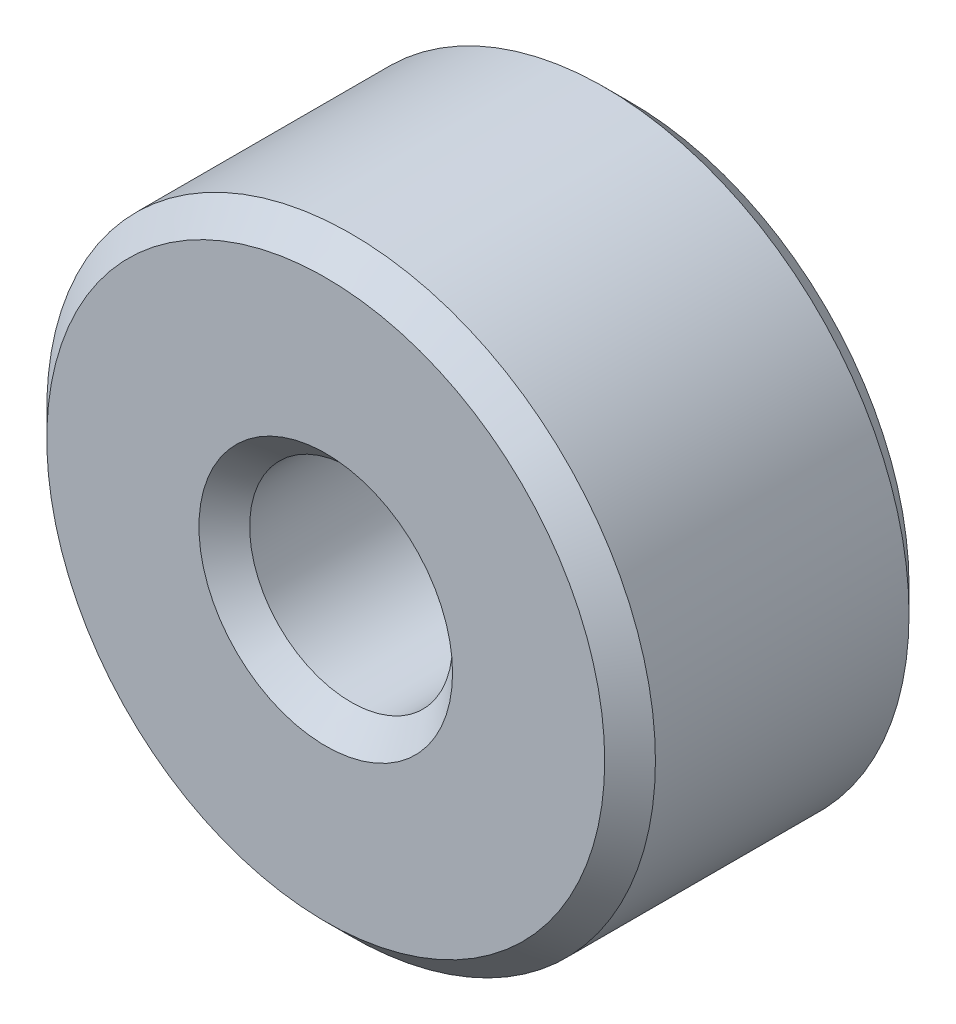
ISO-10303-21;
HEADER;
FILE_DESCRIPTION(('STEP AP214'),'2;1');
FILE_NAME('part.step','',(''),(''),'','','');
FILE_SCHEMA(('AUTOMOTIVE_DESIGN { 1 0 10303 214 1 1 1 1 }'));
ENDSEC;
DATA;
#1=APPLICATION_CONTEXT('core data for automotive mechanical design processes');
#2=APPLICATION_PROTOCOL_DEFINITION('international standard','automotive_design',2000,#1);
#3=PRODUCT_CONTEXT('',#1,'mechanical');
#4=PRODUCT('Part','Part','',(#3));
#5=PRODUCT_RELATED_PRODUCT_CATEGORY('part','',(#4));
#6=PRODUCT_DEFINITION_FORMATION('','',#4);
#7=PRODUCT_DEFINITION_CONTEXT('part definition',#1,'design');
#8=PRODUCT_DEFINITION('design','',#6,#7);
#9=PRODUCT_DEFINITION_SHAPE('','',#8);
#10=(LENGTH_UNIT() NAMED_UNIT(*) SI_UNIT(.MILLI.,.METRE.));
#11=(NAMED_UNIT(*) PLANE_ANGLE_UNIT() SI_UNIT($,.RADIAN.));
#12=(NAMED_UNIT(*) SI_UNIT($,.STERADIAN.) SOLID_ANGLE_UNIT());
#13=UNCERTAINTY_MEASURE_WITH_UNIT(LENGTH_MEASURE(1.E-05),#10,'distance_accuracy_value','');
#14=(GEOMETRIC_REPRESENTATION_CONTEXT(3) GLOBAL_UNCERTAINTY_ASSIGNED_CONTEXT((#13)) GLOBAL_UNIT_ASSIGNED_CONTEXT((#10,
#11,#12)) REPRESENTATION_CONTEXT('',''));
#15=CARTESIAN_POINT('',(0.,0.,0.));
#16=DIRECTION('',(0.,0.,1.));
#17=DIRECTION('',(1.,0.,0.));
#18=AXIS2_PLACEMENT_3D('',#15,#16,#17);
#19=CARTESIAN_POINT('',(0.,0.,3.));
#20=DIRECTION('',(0.,0.,1.));
#21=DIRECTION('',(1.,0.,0.));
#22=AXIS2_PLACEMENT_3D('',#19,#20,#21);
#23=PLANE('',#22);
#24=CARTESIAN_POINT('',(0.,0.,3.));
#25=DIRECTION('',(0.,0.,1.));
#26=DIRECTION('',(1.,0.,0.));
#27=AXIS2_PLACEMENT_3D('',#24,#25,#26);
#28=CIRCLE('',#27,1.25);
#29=CARTESIAN_POINT('',(1.25,0.,3.));
#30=VERTEX_POINT('',#29);
#31=EDGE_CURVE('E70',#30,#30,#28,.F.);
#32=ORIENTED_EDGE('',*,*,#31,.T.);
#33=EDGE_LOOP('',(#32));
#34=FACE_BOUND('',#33,.T.);
#35=CARTESIAN_POINT('',(0.,0.,3.));
#36=DIRECTION('',(0.,0.,1.));
#37=DIRECTION('',(1.,0.,0.));
#38=AXIS2_PLACEMENT_3D('',#35,#36,#37);
#39=CIRCLE('',#38,2.75);
#40=CARTESIAN_POINT('',(2.75,0.,3.));
#41=VERTEX_POINT('',#40);
#42=EDGE_CURVE('E74',#41,#41,#39,.T.);
#43=ORIENTED_EDGE('',*,*,#42,.T.);
#44=EDGE_LOOP('',(#43));
#45=FACE_BOUND('',#44,.T.);
#46=ADVANCED_FACE('F45',(#34,#45),#23,.T.);
#47=CARTESIAN_POINT('',(0.,0.,0.));
#48=DIRECTION('',(0.,0.,1.));
#49=DIRECTION('',(1.,0.,0.));
#50=AXIS2_PLACEMENT_3D('',#47,#48,#49);
#51=PLANE('',#50);
#52=CARTESIAN_POINT('',(0.,0.,0.));
#53=DIRECTION('',(0.,0.,1.));
#54=DIRECTION('',(1.,0.,0.));
#55=AXIS2_PLACEMENT_3D('',#52,#53,#54);
#56=CIRCLE('',#55,1.25);
#57=CARTESIAN_POINT('',(1.25,0.,0.));
#58=VERTEX_POINT('',#57);
#59=EDGE_CURVE('E59',#58,#58,#56,.T.);
#60=ORIENTED_EDGE('',*,*,#59,.T.);
#61=EDGE_LOOP('',(#60));
#62=FACE_BOUND('',#61,.T.);
#63=CARTESIAN_POINT('',(0.,0.,0.));
#64=DIRECTION('',(0.,0.,1.));
#65=DIRECTION('',(1.,0.,0.));
#66=AXIS2_PLACEMENT_3D('',#63,#64,#65);
#67=CIRCLE('',#66,2.75);
#68=CARTESIAN_POINT('',(2.75,0.,0.));
#69=VERTEX_POINT('',#68);
#70=EDGE_CURVE('E64',#69,#69,#67,.F.);
#71=ORIENTED_EDGE('',*,*,#70,.T.);
#72=EDGE_LOOP('',(#71));
#73=FACE_BOUND('',#72,.T.);
#74=ADVANCED_FACE('F97',(#62,#73),#51,.F.);
#75=CARTESIAN_POINT('',(0.,0.,3.));
#76=DIRECTION('',(0.,0.,-1.));
#77=DIRECTION('',(-1.,0.,0.));
#78=AXIS2_PLACEMENT_3D('',#75,#76,#77);
#79=CYLINDRICAL_SURFACE('',#78,3.);
#80=CARTESIAN_POINT('',(0.,0.,0.250000000000001));
#81=DIRECTION('',(0.,0.,1.));
#82=DIRECTION('',(1.,0.,0.));
#83=AXIS2_PLACEMENT_3D('',#80,#81,#82);
#84=CIRCLE('',#83,3.);
#85=CARTESIAN_POINT('',(3.,0.,0.250000000000001));
#86=VERTEX_POINT('',#85);
#87=EDGE_CURVE('E11',#86,#86,#84,.T.);
#88=ORIENTED_EDGE('',*,*,#87,.T.);
#89=EDGE_LOOP('',(#88));
#90=FACE_BOUND('',#89,.T.);
#91=CARTESIAN_POINT('',(0.,0.,2.75));
#92=DIRECTION('',(0.,0.,1.));
#93=DIRECTION('',(1.,0.,0.));
#94=AXIS2_PLACEMENT_3D('',#91,#92,#93);
#95=CIRCLE('',#94,3.);
#96=CARTESIAN_POINT('',(3.,0.,2.75));
#97=VERTEX_POINT('',#96);
#98=EDGE_CURVE('E54',#97,#97,#95,.F.);
#99=ORIENTED_EDGE('',*,*,#98,.T.);
#100=EDGE_LOOP('',(#99));
#101=FACE_BOUND('',#100,.T.);
#102=ADVANCED_FACE('F100',(#90,#101),#79,.T.);
#103=CARTESIAN_POINT('',(0.,0.,3.));
#104=DIRECTION('',(0.,0.,-1.));
#105=DIRECTION('',(-1.,0.,0.));
#106=AXIS2_PLACEMENT_3D('',#103,#104,#105);
#107=CYLINDRICAL_SURFACE('',#106,1.);
#108=CARTESIAN_POINT('',(0.,0.,2.75));
#109=DIRECTION('',(0.,0.,1.));
#110=DIRECTION('',(1.,0.,0.));
#111=AXIS2_PLACEMENT_3D('',#108,#109,#110);
#112=CIRCLE('',#111,1.);
#113=CARTESIAN_POINT('',(1.,0.,2.75));
#114=VERTEX_POINT('',#113);
#115=EDGE_CURVE('E78',#114,#114,#112,.T.);
#116=ORIENTED_EDGE('',*,*,#115,.T.);
#117=EDGE_LOOP('',(#116));
#118=FACE_BOUND('',#117,.T.);
#119=CARTESIAN_POINT('',(0.,0.,0.250000000000001));
#120=DIRECTION('',(0.,0.,1.));
#121=DIRECTION('',(1.,0.,0.));
#122=AXIS2_PLACEMENT_3D('',#119,#120,#121);
#123=CIRCLE('',#122,1.);
#124=CARTESIAN_POINT('',(1.,0.,0.250000000000001));
#125=VERTEX_POINT('',#124);
#126=EDGE_CURVE('E82',#125,#125,#123,.F.);
#127=ORIENTED_EDGE('',*,*,#126,.T.);
#128=EDGE_LOOP('',(#127));
#129=FACE_BOUND('',#128,.T.);
#130=ADVANCED_FACE('F87',(#118,#129),#107,.F.);
#131=CARTESIAN_POINT('',(0.,0.,2.75));
#132=DIRECTION('',(0.,0.,1.));
#133=DIRECTION('',(1.,0.,0.));
#134=AXIS2_PLACEMENT_3D('',#131,#132,#133);
#135=CONICAL_SURFACE('',#134,1.,0.78539816339745);
#136=ORIENTED_EDGE('',*,*,#31,.F.);
#137=EDGE_LOOP('',(#136));
#138=FACE_BOUND('',#137,.T.);
#139=ORIENTED_EDGE('',*,*,#115,.F.);
#140=EDGE_LOOP('',(#139));
#141=FACE_BOUND('',#140,.T.);
#142=ADVANCED_FACE('F93',(#138,#141),#135,.F.);
#143=CARTESIAN_POINT('',(0.,0.,0.));
#144=DIRECTION('',(0.,0.,-1.));
#145=DIRECTION('',(-1.,0.,0.));
#146=AXIS2_PLACEMENT_3D('',#143,#144,#145);
#147=CONICAL_SURFACE('',#146,1.25,0.785398163397447);
#148=ORIENTED_EDGE('',*,*,#126,.F.);
#149=EDGE_LOOP('',(#148));
#150=FACE_BOUND('',#149,.T.);
#151=ORIENTED_EDGE('',*,*,#59,.F.);
#152=EDGE_LOOP('',(#151));
#153=FACE_BOUND('',#152,.T.);
#154=ADVANCED_FACE('F89',(#150,#153),#147,.F.);
#155=CARTESIAN_POINT('',(0.,0.,0.250000000000001));
#156=DIRECTION('',(0.,0.,1.));
#157=DIRECTION('',(1.,0.,0.));
#158=AXIS2_PLACEMENT_3D('',#155,#156,#157);
#159=CONICAL_SURFACE('',#158,3.,0.78539816339745);
#160=ORIENTED_EDGE('',*,*,#70,.F.);
#161=EDGE_LOOP('',(#160));
#162=FACE_BOUND('',#161,.T.);
#163=ORIENTED_EDGE('',*,*,#87,.F.);
#164=EDGE_LOOP('',(#163));
#165=FACE_BOUND('',#164,.T.);
#166=ADVANCED_FACE('F92',(#162,#165),#159,.T.);
#167=CARTESIAN_POINT('',(0.,0.,3.));
#168=DIRECTION('',(0.,0.,-1.));
#169=DIRECTION('',(-1.,0.,0.));
#170=AXIS2_PLACEMENT_3D('',#167,#168,#169);
#171=CONICAL_SURFACE('',#170,2.75,0.785398163397447);
#172=ORIENTED_EDGE('',*,*,#98,.F.);
#173=EDGE_LOOP('',(#172));
#174=FACE_BOUND('',#173,.T.);
#175=ORIENTED_EDGE('',*,*,#42,.F.);
#176=EDGE_LOOP('',(#175));
#177=FACE_BOUND('',#176,.T.);
#178=ADVANCED_FACE('F48',(#174,#177),#171,.T.);
#179=CLOSED_SHELL('',(#46,#74,#102,#130,#142,#154,#166,#178));
#180=MANIFOLD_SOLID_BREP('B2',#179);
#181=ADVANCED_BREP_SHAPE_REPRESENTATION('',(#18,#180),#14);
#182=SHAPE_DEFINITION_REPRESENTATION(#9,#181);
ENDSEC;
END-ISO-10303-21;
